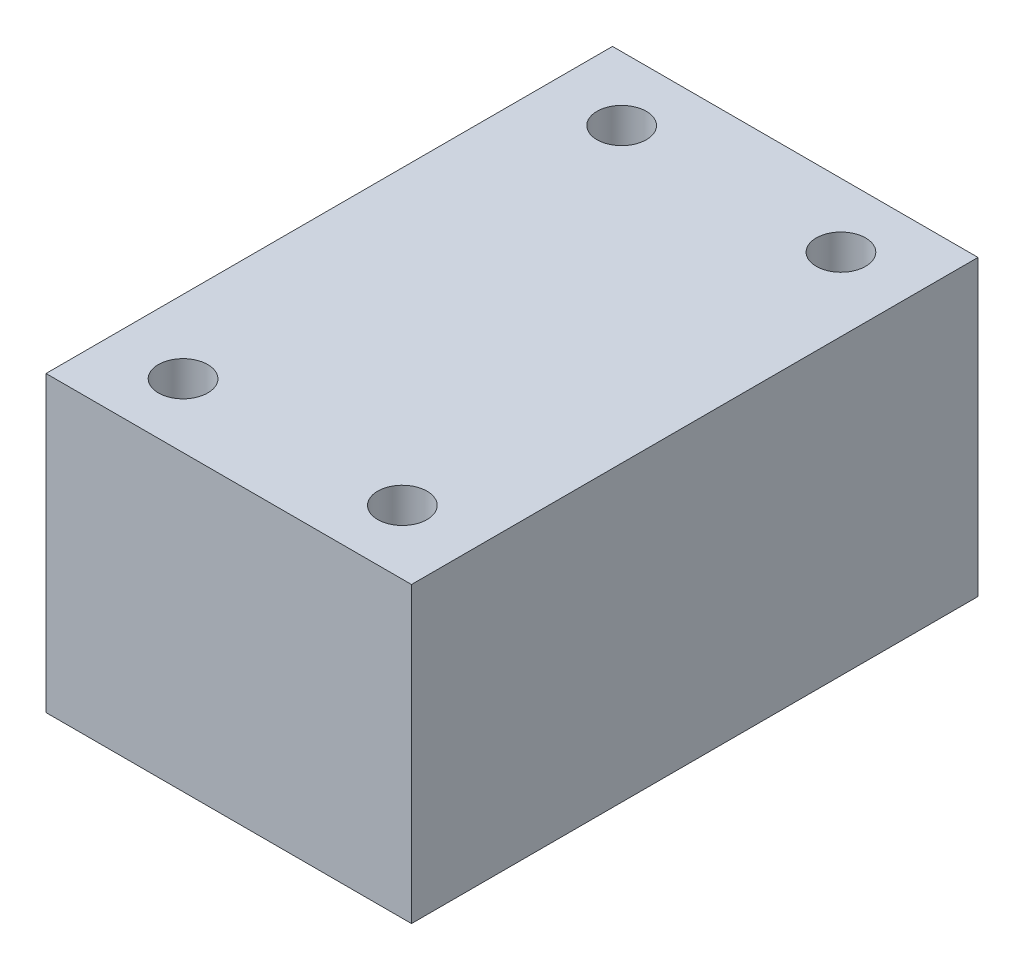
ISO-10303-21;
HEADER;
FILE_DESCRIPTION(('STEP AP214'),'2;1');
FILE_NAME('part.step','',(''),(''),'','','');
FILE_SCHEMA(('AUTOMOTIVE_DESIGN { 1 0 10303 214 1 1 1 1 }'));
ENDSEC;
DATA;
#1=APPLICATION_CONTEXT('core data for automotive mechanical design processes');
#2=APPLICATION_PROTOCOL_DEFINITION('international standard','automotive_design',2000,#1);
#3=PRODUCT_CONTEXT('',#1,'mechanical');
#4=PRODUCT('Part','Part','',(#3));
#5=PRODUCT_RELATED_PRODUCT_CATEGORY('part','',(#4));
#6=PRODUCT_DEFINITION_FORMATION('','',#4);
#7=PRODUCT_DEFINITION_CONTEXT('part definition',#1,'design');
#8=PRODUCT_DEFINITION('design','',#6,#7);
#9=PRODUCT_DEFINITION_SHAPE('','',#8);
#10=(LENGTH_UNIT() NAMED_UNIT(*) SI_UNIT(.MILLI.,.METRE.));
#11=(NAMED_UNIT(*) PLANE_ANGLE_UNIT() SI_UNIT($,.RADIAN.));
#12=(NAMED_UNIT(*) SI_UNIT($,.STERADIAN.) SOLID_ANGLE_UNIT());
#13=UNCERTAINTY_MEASURE_WITH_UNIT(LENGTH_MEASURE(1.E-05),#10,'distance_accuracy_value','');
#14=(GEOMETRIC_REPRESENTATION_CONTEXT(3) GLOBAL_UNCERTAINTY_ASSIGNED_CONTEXT((#13)) GLOBAL_UNIT_ASSIGNED_CONTEXT((#10,
#11,#12)) REPRESENTATION_CONTEXT('',''));
#15=CARTESIAN_POINT('',(0.,0.,0.));
#16=DIRECTION('',(0.,0.,1.));
#17=DIRECTION('',(1.,0.,0.));
#18=AXIS2_PLACEMENT_3D('',#15,#16,#17);
#19=CARTESIAN_POINT('',(-28.1917671409819,-1.4210854715202E-13,246.771499999996));
#20=DIRECTION('',(0.,1.,0.));
#21=DIRECTION('',(1.,0.,0.));
#22=AXIS2_PLACEMENT_3D('',#19,#20,#21);
#23=PLANE('',#22);
#24=CARTESIAN_POINT('',(-40.1917671409817,0.,222.771499999996));
#25=DIRECTION('',(0.,-1.,0.));
#26=DIRECTION('',(1.,0.,0.));
#27=AXIS2_PLACEMENT_3D('',#24,#25,#26);
#28=CIRCLE('',#27,2.7);
#29=CARTESIAN_POINT('',(-42.8917671409817,0.,222.771499999996));
#30=VERTEX_POINT('',#29);
#31=EDGE_CURVE('E182',#30,#30,#28,.T.);
#32=ORIENTED_EDGE('',*,*,#31,.F.);
#33=EDGE_LOOP('',(#32));
#34=FACE_BOUND('',#33,.T.);
#35=CARTESIAN_POINT('',(-16.1917671409821,-1.4210854715202E-13,270.771499999996));
#36=DIRECTION('',(0.,-1.,0.));
#37=DIRECTION('',(1.,0.,0.));
#38=AXIS2_PLACEMENT_3D('',#35,#36,#37);
#39=CIRCLE('',#38,2.7);
#40=CARTESIAN_POINT('',(-18.8917671409821,-1.4210854715202E-13,270.771499999996));
#41=VERTEX_POINT('',#40);
#42=EDGE_CURVE('E163',#41,#41,#39,.T.);
#43=ORIENTED_EDGE('',*,*,#42,.F.);
#44=EDGE_LOOP('',(#43));
#45=FACE_BOUND('',#44,.T.);
#46=CARTESIAN_POINT('',(-40.1917671409817,-1.4210854715202E-13,270.771499999996));
#47=DIRECTION('',(0.,-1.,0.));
#48=DIRECTION('',(1.,0.,0.));
#49=AXIS2_PLACEMENT_3D('',#46,#47,#48);
#50=CIRCLE('',#49,2.7);
#51=CARTESIAN_POINT('',(-42.8917671409817,-1.4210854715202E-13,270.771499999996));
#52=VERTEX_POINT('',#51);
#53=EDGE_CURVE('E161',#52,#52,#50,.T.);
#54=ORIENTED_EDGE('',*,*,#53,.F.);
#55=EDGE_LOOP('',(#54));
#56=FACE_BOUND('',#55,.T.);
#57=CARTESIAN_POINT('',(-16.191767140982,0.,222.771499999996));
#58=DIRECTION('',(0.,-1.,0.));
#59=DIRECTION('',(1.,0.,0.));
#60=AXIS2_PLACEMENT_3D('',#57,#58,#59);
#61=CIRCLE('',#60,2.7);
#62=CARTESIAN_POINT('',(-18.891767140982,0.,222.771499999996));
#63=VERTEX_POINT('',#62);
#64=EDGE_CURVE('E145',#63,#63,#61,.T.);
#65=ORIENTED_EDGE('',*,*,#64,.F.);
#66=EDGE_LOOP('',(#65));
#67=FACE_BOUND('',#66,.T.);
#68=DIRECTION('',(0.,0.,-1.));
#69=VECTOR('',#68,1.);
#70=CARTESIAN_POINT('',(-48.1917671409816,-1.4210854715202E-13,277.771499999996));
#71=LINE('',#70,#69);
#72=CARTESIAN_POINT('',(-48.1917671409816,-1.4210854715202E-13,277.771499999996));
#73=VERTEX_POINT('',#72);
#74=CARTESIAN_POINT('',(-48.1917671409816,0.,215.771499999996));
#75=VERTEX_POINT('',#74);
#76=EDGE_CURVE('E27',#73,#75,#71,.T.);
#77=ORIENTED_EDGE('',*,*,#76,.T.);
#78=DIRECTION('',(1.,0.,0.));
#79=VECTOR('',#78,1.);
#80=CARTESIAN_POINT('',(-48.1917671409816,0.,215.771499999996));
#81=LINE('',#80,#79);
#82=CARTESIAN_POINT('',(-8.19176714098214,-1.4210854715202E-13,215.771499999996));
#83=VERTEX_POINT('',#82);
#84=EDGE_CURVE('E132',#75,#83,#81,.T.);
#85=ORIENTED_EDGE('',*,*,#84,.T.);
#86=DIRECTION('',(0.,0.,1.));
#87=VECTOR('',#86,1.);
#88=CARTESIAN_POINT('',(-8.19176714098214,-1.4210854715202E-13,215.771499999996));
#89=LINE('',#88,#87);
#90=CARTESIAN_POINT('',(-8.19176714098222,-1.42108547152019E-13,277.771499999996));
#91=VERTEX_POINT('',#90);
#92=EDGE_CURVE('E117',#83,#91,#89,.T.);
#93=ORIENTED_EDGE('',*,*,#92,.T.);
#94=DIRECTION('',(-1.,0.,0.));
#95=VECTOR('',#94,1.);
#96=CARTESIAN_POINT('',(-8.19176714098222,-1.42108547152019E-13,277.771499999996));
#97=LINE('',#96,#95);
#98=EDGE_CURVE('E105',#91,#73,#97,.T.);
#99=ORIENTED_EDGE('',*,*,#98,.T.);
#100=EDGE_LOOP('',(#77,#85,#93,#99));
#101=FACE_BOUND('',#100,.T.);
#102=ADVANCED_FACE('F17',(#34,#45,#56,#67,#101),#23,.F.);
#103=CARTESIAN_POINT('',(-28.1917671409819,32.141,246.771499999996));
#104=DIRECTION('',(0.,1.,0.));
#105=DIRECTION('',(1.,0.,0.));
#106=AXIS2_PLACEMENT_3D('',#103,#104,#105);
#107=PLANE('',#106);
#108=CARTESIAN_POINT('',(-40.1917671409817,32.141,222.771499999996));
#109=DIRECTION('',(0.,-1.,0.));
#110=DIRECTION('',(1.,0.,0.));
#111=AXIS2_PLACEMENT_3D('',#108,#109,#110);
#112=CIRCLE('',#111,2.7);
#113=CARTESIAN_POINT('',(-42.8917671409817,32.141,222.771499999996));
#114=VERTEX_POINT('',#113);
#115=EDGE_CURVE('E191',#114,#114,#112,.T.);
#116=ORIENTED_EDGE('',*,*,#115,.T.);
#117=EDGE_LOOP('',(#116));
#118=FACE_BOUND('',#117,.T.);
#119=CARTESIAN_POINT('',(-16.1917671409821,32.141,270.771499999996));
#120=DIRECTION('',(0.,-1.,0.));
#121=DIRECTION('',(1.,0.,0.));
#122=AXIS2_PLACEMENT_3D('',#119,#120,#121);
#123=CIRCLE('',#122,2.7);
#124=CARTESIAN_POINT('',(-18.8917671409821,32.141,270.771499999996));
#125=VERTEX_POINT('',#124);
#126=EDGE_CURVE('E175',#125,#125,#123,.T.);
#127=ORIENTED_EDGE('',*,*,#126,.T.);
#128=EDGE_LOOP('',(#127));
#129=FACE_BOUND('',#128,.T.);
#130=CARTESIAN_POINT('',(-40.1917671409817,32.141,270.771499999996));
#131=DIRECTION('',(0.,-1.,0.));
#132=DIRECTION('',(1.,0.,0.));
#133=AXIS2_PLACEMENT_3D('',#130,#131,#132);
#134=CIRCLE('',#133,2.7);
#135=CARTESIAN_POINT('',(-42.8917671409817,32.141,270.771499999996));
#136=VERTEX_POINT('',#135);
#137=EDGE_CURVE('E165',#136,#136,#134,.T.);
#138=ORIENTED_EDGE('',*,*,#137,.T.);
#139=EDGE_LOOP('',(#138));
#140=FACE_BOUND('',#139,.T.);
#141=CARTESIAN_POINT('',(-16.191767140982,32.141,222.771499999996));
#142=DIRECTION('',(0.,-1.,0.));
#143=DIRECTION('',(1.,0.,0.));
#144=AXIS2_PLACEMENT_3D('',#141,#142,#143);
#145=CIRCLE('',#144,2.7);
#146=CARTESIAN_POINT('',(-18.891767140982,32.141,222.771499999996));
#147=VERTEX_POINT('',#146);
#148=EDGE_CURVE('E169',#147,#147,#145,.T.);
#149=ORIENTED_EDGE('',*,*,#148,.T.);
#150=EDGE_LOOP('',(#149));
#151=FACE_BOUND('',#150,.T.);
#152=DIRECTION('',(0.,0.,1.));
#153=VECTOR('',#152,1.);
#154=CARTESIAN_POINT('',(-48.1917671409816,32.141,277.771499999996));
#155=LINE('',#154,#153);
#156=CARTESIAN_POINT('',(-48.1917671409816,32.141,215.771499999996));
#157=VERTEX_POINT('',#156);
#158=CARTESIAN_POINT('',(-48.1917671409816,32.141,277.771499999996));
#159=VERTEX_POINT('',#158);
#160=EDGE_CURVE('E11',#157,#159,#155,.T.);
#161=ORIENTED_EDGE('',*,*,#160,.T.);
#162=DIRECTION('',(1.,0.,0.));
#163=VECTOR('',#162,1.);
#164=CARTESIAN_POINT('',(-8.19176714098222,32.141,277.771499999996));
#165=LINE('',#164,#163);
#166=CARTESIAN_POINT('',(-8.19176714098222,32.141,277.771499999996));
#167=VERTEX_POINT('',#166);
#168=EDGE_CURVE('E95',#159,#167,#165,.T.);
#169=ORIENTED_EDGE('',*,*,#168,.T.);
#170=DIRECTION('',(0.,0.,-1.));
#171=VECTOR('',#170,1.);
#172=CARTESIAN_POINT('',(-8.19176714098214,32.141,215.771499999996));
#173=LINE('',#172,#171);
#174=CARTESIAN_POINT('',(-8.19176714098214,32.141,215.771499999996));
#175=VERTEX_POINT('',#174);
#176=EDGE_CURVE('E96',#167,#175,#173,.T.);
#177=ORIENTED_EDGE('',*,*,#176,.T.);
#178=DIRECTION('',(-1.,0.,0.));
#179=VECTOR('',#178,1.);
#180=CARTESIAN_POINT('',(-48.1917671409816,32.141,215.771499999996));
#181=LINE('',#180,#179);
#182=EDGE_CURVE('E139',#175,#157,#181,.T.);
#183=ORIENTED_EDGE('',*,*,#182,.T.);
#184=EDGE_LOOP('',(#161,#169,#177,#183));
#185=FACE_BOUND('',#184,.T.);
#186=ADVANCED_FACE('F94',(#118,#129,#140,#151,#185),#107,.T.);
#187=CARTESIAN_POINT('',(-48.1917671409816,0.,215.771499999996));
#188=DIRECTION('',(-1.,0.,0.));
#189=DIRECTION('',(0.,0.,1.));
#190=AXIS2_PLACEMENT_3D('',#187,#188,#189);
#191=PLANE('',#190);
#192=ORIENTED_EDGE('',*,*,#76,.F.);
#193=DIRECTION('',(0.,1.,0.));
#194=VECTOR('',#193,1.);
#195=CARTESIAN_POINT('',(-48.1917671409816,-1.4210854715202E-13,277.771499999996));
#196=LINE('',#195,#194);
#197=EDGE_CURVE('E101',#73,#159,#196,.T.);
#198=ORIENTED_EDGE('',*,*,#197,.T.);
#199=ORIENTED_EDGE('',*,*,#160,.F.);
#200=DIRECTION('',(0.,1.,0.));
#201=VECTOR('',#200,1.);
#202=CARTESIAN_POINT('',(-48.1917671409816,0.,215.771499999996));
#203=LINE('',#202,#201);
#204=EDGE_CURVE('E136',#75,#157,#203,.T.);
#205=ORIENTED_EDGE('',*,*,#204,.F.);
#206=EDGE_LOOP('',(#192,#198,#199,#205));
#207=FACE_BOUND('',#206,.T.);
#208=ADVANCED_FACE('F140',(#207),#191,.T.);
#209=CARTESIAN_POINT('',(-48.1917671409816,-1.4210854715202E-13,277.771499999996));
#210=DIRECTION('',(0.,0.,1.));
#211=DIRECTION('',(1.,0.,0.));
#212=AXIS2_PLACEMENT_3D('',#209,#210,#211);
#213=PLANE('',#212);
#214=ORIENTED_EDGE('',*,*,#98,.F.);
#215=DIRECTION('',(0.,1.,0.));
#216=VECTOR('',#215,1.);
#217=CARTESIAN_POINT('',(-8.19176714098222,-1.42108547152019E-13,277.771499999996));
#218=LINE('',#217,#216);
#219=EDGE_CURVE('E104',#91,#167,#218,.T.);
#220=ORIENTED_EDGE('',*,*,#219,.T.);
#221=ORIENTED_EDGE('',*,*,#168,.F.);
#222=ORIENTED_EDGE('',*,*,#197,.F.);
#223=EDGE_LOOP('',(#214,#220,#221,#222));
#224=FACE_BOUND('',#223,.T.);
#225=ADVANCED_FACE('F106',(#224),#213,.T.);
#226=CARTESIAN_POINT('',(-8.19176714098222,-1.42108547152019E-13,277.771499999996));
#227=DIRECTION('',(1.,0.,0.));
#228=DIRECTION('',(0.,0.,1.));
#229=AXIS2_PLACEMENT_3D('',#226,#227,#228);
#230=PLANE('',#229);
#231=ORIENTED_EDGE('',*,*,#92,.F.);
#232=DIRECTION('',(0.,1.,0.));
#233=VECTOR('',#232,1.);
#234=CARTESIAN_POINT('',(-8.19176714098214,-1.4210854715202E-13,215.771499999996));
#235=LINE('',#234,#233);
#236=EDGE_CURVE('E111',#83,#175,#235,.T.);
#237=ORIENTED_EDGE('',*,*,#236,.T.);
#238=ORIENTED_EDGE('',*,*,#176,.F.);
#239=ORIENTED_EDGE('',*,*,#219,.F.);
#240=EDGE_LOOP('',(#231,#237,#238,#239));
#241=FACE_BOUND('',#240,.T.);
#242=ADVANCED_FACE('F115',(#241),#230,.T.);
#243=CARTESIAN_POINT('',(-8.19176714098214,-1.4210854715202E-13,215.771499999996));
#244=DIRECTION('',(0.,0.,-1.));
#245=DIRECTION('',(0.,-1.,0.));
#246=AXIS2_PLACEMENT_3D('',#243,#244,#245);
#247=PLANE('',#246);
#248=ORIENTED_EDGE('',*,*,#84,.F.);
#249=ORIENTED_EDGE('',*,*,#204,.T.);
#250=ORIENTED_EDGE('',*,*,#182,.F.);
#251=ORIENTED_EDGE('',*,*,#236,.F.);
#252=EDGE_LOOP('',(#248,#249,#250,#251));
#253=FACE_BOUND('',#252,.T.);
#254=ADVANCED_FACE('F142',(#253),#247,.T.);
#255=CARTESIAN_POINT('',(-16.191767140982,0.,222.771499999996));
#256=DIRECTION('',(0.,1.,0.));
#257=DIRECTION('',(1.,0.,0.));
#258=AXIS2_PLACEMENT_3D('',#255,#256,#257);
#259=CYLINDRICAL_SURFACE('',#258,2.7);
#260=ORIENTED_EDGE('',*,*,#148,.F.);
#261=DIRECTION('',(0.,-1.,0.));
#262=VECTOR('',#261,1.);
#263=CARTESIAN_POINT('',(-18.891767140982,0.,222.771499999996));
#264=LINE('',#263,#262);
#265=EDGE_CURVE('E149',#147,#63,#264,.T.);
#266=ORIENTED_EDGE('',*,*,#265,.T.);
#267=ORIENTED_EDGE('',*,*,#64,.T.);
#268=ORIENTED_EDGE('',*,*,#265,.F.);
#269=EDGE_LOOP('',(#260,#266,#267,#268));
#270=FACE_BOUND('',#269,.T.);
#271=ADVANCED_FACE('F213',(#270),#259,.F.);
#272=CARTESIAN_POINT('',(-40.1917671409817,-1.4210854715202E-13,270.771499999996));
#273=DIRECTION('',(0.,1.,0.));
#274=DIRECTION('',(1.,0.,0.));
#275=AXIS2_PLACEMENT_3D('',#272,#273,#274);
#276=CYLINDRICAL_SURFACE('',#275,2.7);
#277=ORIENTED_EDGE('',*,*,#137,.F.);
#278=DIRECTION('',(0.,-1.,0.));
#279=VECTOR('',#278,1.);
#280=CARTESIAN_POINT('',(-42.8917671409817,-1.4210854715202E-13,270.771499999996));
#281=LINE('',#280,#279);
#282=EDGE_CURVE('E157',#136,#52,#281,.T.);
#283=ORIENTED_EDGE('',*,*,#282,.T.);
#284=ORIENTED_EDGE('',*,*,#53,.T.);
#285=ORIENTED_EDGE('',*,*,#282,.F.);
#286=EDGE_LOOP('',(#277,#283,#284,#285));
#287=FACE_BOUND('',#286,.T.);
#288=ADVANCED_FACE('F229',(#287),#276,.F.);
#289=CARTESIAN_POINT('',(-16.1917671409821,-1.4210854715202E-13,270.771499999996));
#290=DIRECTION('',(0.,1.,0.));
#291=DIRECTION('',(1.,0.,0.));
#292=AXIS2_PLACEMENT_3D('',#289,#290,#291);
#293=CYLINDRICAL_SURFACE('',#292,2.7);
#294=ORIENTED_EDGE('',*,*,#126,.F.);
#295=DIRECTION('',(0.,-1.,0.));
#296=VECTOR('',#295,1.);
#297=CARTESIAN_POINT('',(-18.8917671409821,-1.4210854715202E-13,270.771499999996));
#298=LINE('',#297,#296);
#299=EDGE_CURVE('E170',#125,#41,#298,.T.);
#300=ORIENTED_EDGE('',*,*,#299,.T.);
#301=ORIENTED_EDGE('',*,*,#42,.T.);
#302=ORIENTED_EDGE('',*,*,#299,.F.);
#303=EDGE_LOOP('',(#294,#300,#301,#302));
#304=FACE_BOUND('',#303,.T.);
#305=ADVANCED_FACE('F233',(#304),#293,.F.);
#306=CARTESIAN_POINT('',(-40.1917671409817,0.,222.771499999996));
#307=DIRECTION('',(0.,1.,0.));
#308=DIRECTION('',(1.,0.,0.));
#309=AXIS2_PLACEMENT_3D('',#306,#307,#308);
#310=CYLINDRICAL_SURFACE('',#309,2.7);
#311=ORIENTED_EDGE('',*,*,#115,.F.);
#312=DIRECTION('',(0.,-1.,0.));
#313=VECTOR('',#312,1.);
#314=CARTESIAN_POINT('',(-42.8917671409817,0.,222.771499999996));
#315=LINE('',#314,#313);
#316=EDGE_CURVE('E190',#114,#30,#315,.T.);
#317=ORIENTED_EDGE('',*,*,#316,.T.);
#318=ORIENTED_EDGE('',*,*,#31,.T.);
#319=ORIENTED_EDGE('',*,*,#316,.F.);
#320=EDGE_LOOP('',(#311,#317,#318,#319));
#321=FACE_BOUND('',#320,.T.);
#322=ADVANCED_FACE('F199',(#321),#310,.F.);
#323=CLOSED_SHELL('',(#102,#186,#208,#225,#242,#254,#271,#288,#305,#322));
#324=MANIFOLD_SOLID_BREP('B1',#323);
#325=ADVANCED_BREP_SHAPE_REPRESENTATION('',(#18,#324),#14);
#326=SHAPE_DEFINITION_REPRESENTATION(#9,#325);
ENDSEC;
END-ISO-10303-21;
